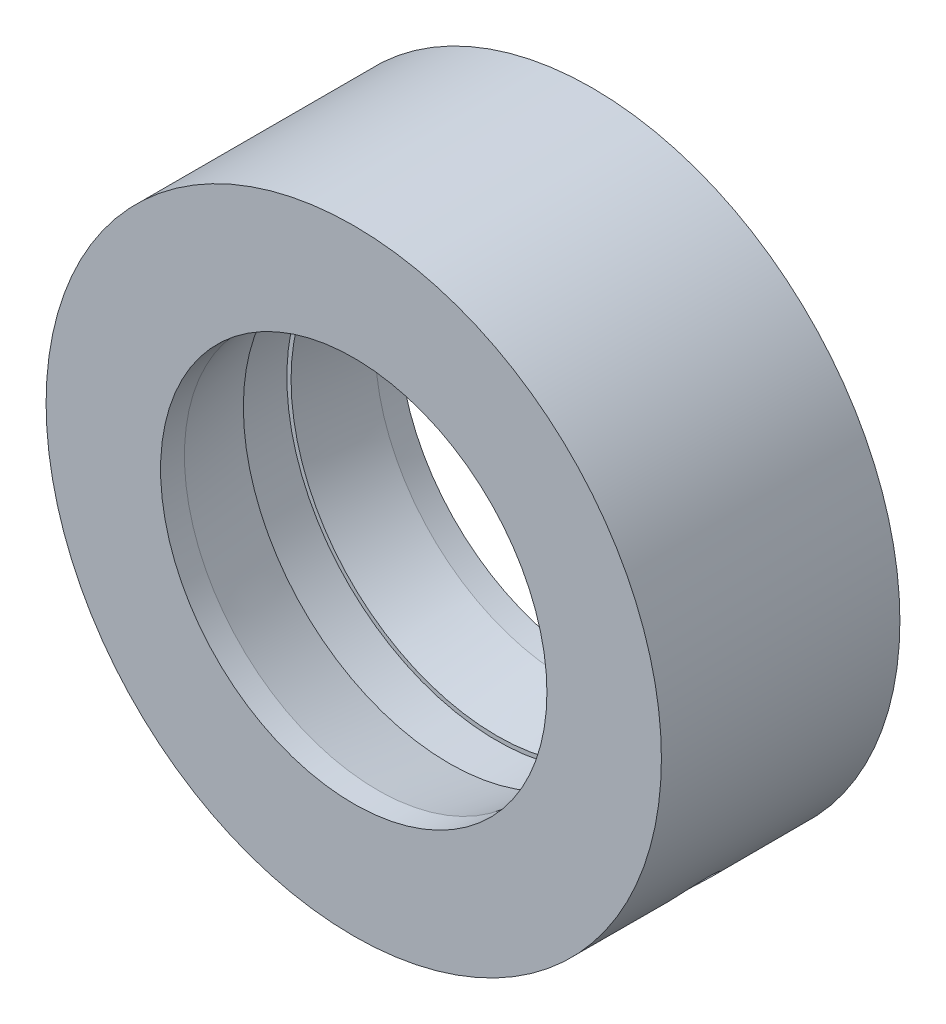
ISO-10303-21;
HEADER;
FILE_DESCRIPTION(('STEP AP214'),'2;1');
FILE_NAME('part.step','',(''),(''),'','','');
FILE_SCHEMA(('AUTOMOTIVE_DESIGN { 1 0 10303 214 1 1 1 1 }'));
ENDSEC;
DATA;
#1=APPLICATION_CONTEXT('core data for automotive mechanical design processes');
#2=APPLICATION_PROTOCOL_DEFINITION('international standard','automotive_design',2000,#1);
#3=PRODUCT_CONTEXT('',#1,'mechanical');
#4=PRODUCT('Part','Part','',(#3));
#5=PRODUCT_RELATED_PRODUCT_CATEGORY('part','',(#4));
#6=PRODUCT_DEFINITION_FORMATION('','',#4);
#7=PRODUCT_DEFINITION_CONTEXT('part definition',#1,'design');
#8=PRODUCT_DEFINITION('design','',#6,#7);
#9=PRODUCT_DEFINITION_SHAPE('','',#8);
#10=(LENGTH_UNIT() NAMED_UNIT(*) SI_UNIT(.MILLI.,.METRE.));
#11=(NAMED_UNIT(*) PLANE_ANGLE_UNIT() SI_UNIT($,.RADIAN.));
#12=(NAMED_UNIT(*) SI_UNIT($,.STERADIAN.) SOLID_ANGLE_UNIT());
#13=UNCERTAINTY_MEASURE_WITH_UNIT(LENGTH_MEASURE(1.E-05),#10,'distance_accuracy_value','');
#14=(GEOMETRIC_REPRESENTATION_CONTEXT(3) GLOBAL_UNCERTAINTY_ASSIGNED_CONTEXT((#13)) GLOBAL_UNIT_ASSIGNED_CONTEXT((#10,
#11,#12)) REPRESENTATION_CONTEXT('',''));
#15=CARTESIAN_POINT('',(0.,0.,0.));
#16=DIRECTION('',(0.,0.,1.));
#17=DIRECTION('',(1.,0.,0.));
#18=AXIS2_PLACEMENT_3D('',#15,#16,#17);
#19=CARTESIAN_POINT('',(70.0352073297109,17.5689247360191,9.));
#20=DIRECTION('',(0.,0.,1.));
#21=DIRECTION('',(1.,0.,0.));
#22=AXIS2_PLACEMENT_3D('',#19,#20,#21);
#23=PLANE('',#22);
#24=CARTESIAN_POINT('',(73.461996441999,0.,9.));
#25=DIRECTION('',(0.,0.,1.));
#26=DIRECTION('',(1.,0.,0.));
#27=AXIS2_PLACEMENT_3D('',#24,#25,#26);
#28=CIRCLE('',#27,8.09999999999999);
#29=CARTESIAN_POINT('',(81.561996441999,0.,9.));
#30=VERTEX_POINT('',#29);
#31=EDGE_CURVE('E101',#30,#30,#28,.T.);
#32=ORIENTED_EDGE('',*,*,#31,.F.);
#33=EDGE_LOOP('',(#32));
#34=FACE_BOUND('',#33,.T.);
#35=CARTESIAN_POINT('',(73.461996441999,0.,9.));
#36=DIRECTION('',(0.,0.,1.));
#37=DIRECTION('',(1.,0.,0.));
#38=AXIS2_PLACEMENT_3D('',#35,#36,#37);
#39=CIRCLE('',#38,12.9);
#40=CARTESIAN_POINT('',(86.361996441999,0.,9.));
#41=VERTEX_POINT('',#40);
#42=EDGE_CURVE('E68',#41,#41,#39,.T.);
#43=ORIENTED_EDGE('',*,*,#42,.T.);
#44=EDGE_LOOP('',(#43));
#45=FACE_BOUND('',#44,.T.);
#46=ADVANCED_FACE('F42',(#34,#45),#23,.T.);
#47=CARTESIAN_POINT('',(5.89307170597994,46.573210887712,-1.));
#48=DIRECTION('',(0.,0.,-1.));
#49=DIRECTION('',(-1.,0.,0.));
#50=AXIS2_PLACEMENT_3D('',#47,#48,#49);
#51=PLANE('',#50);
#52=CARTESIAN_POINT('',(73.461996441999,0.,-1.));
#53=DIRECTION('',(0.,0.,-1.));
#54=DIRECTION('',(-1.,0.,0.));
#55=AXIS2_PLACEMENT_3D('',#52,#53,#54);
#56=CIRCLE('',#55,8.09999999999999);
#57=CARTESIAN_POINT('',(65.361996441999,0.,-1.));
#58=VERTEX_POINT('',#57);
#59=EDGE_CURVE('E109',#58,#58,#56,.T.);
#60=ORIENTED_EDGE('',*,*,#59,.F.);
#61=EDGE_LOOP('',(#60));
#62=FACE_BOUND('',#61,.T.);
#63=CARTESIAN_POINT('',(73.461996441999,0.,-1.));
#64=DIRECTION('',(0.,0.,-1.));
#65=DIRECTION('',(-1.,0.,0.));
#66=AXIS2_PLACEMENT_3D('',#63,#64,#65);
#67=CIRCLE('',#66,12.9);
#68=CARTESIAN_POINT('',(60.561996441999,0.,-1.));
#69=VERTEX_POINT('',#68);
#70=EDGE_CURVE('E102',#69,#69,#67,.T.);
#71=ORIENTED_EDGE('',*,*,#70,.T.);
#72=EDGE_LOOP('',(#71));
#73=FACE_BOUND('',#72,.T.);
#74=ADVANCED_FACE('F132',(#62,#73),#51,.T.);
#75=CARTESIAN_POINT('',(73.461996441999,0.,8.));
#76=DIRECTION('',(0.,0.,-1.));
#77=DIRECTION('',(-1.,0.,0.));
#78=AXIS2_PLACEMENT_3D('',#75,#76,#77);
#79=CYLINDRICAL_SURFACE('',#78,12.9);
#80=ORIENTED_EDGE('',*,*,#42,.F.);
#81=EDGE_LOOP('',(#80));
#82=FACE_BOUND('',#81,.T.);
#83=ORIENTED_EDGE('',*,*,#70,.F.);
#84=EDGE_LOOP('',(#83));
#85=FACE_BOUND('',#84,.T.);
#86=CARTESIAN_POINT('',(83.2958693438563,-8.3489486613655,4.));
#87=CARTESIAN_POINT('',(83.2958679778543,-8.34895077080571,4.0560686927923));
#88=CARTESIAN_POINT('',(83.2927988602991,-8.35256943382663,4.11217590008152));
#89=CARTESIAN_POINT('',(83.2805789666321,-8.36693030112704,4.22283855553347));
#90=CARTESIAN_POINT('',(83.2714212406867,-8.37768064582371,4.2773921560408));
#91=CARTESIAN_POINT('',(83.2472262282993,-8.40592777719485,4.3833284360185));
#92=CARTESIAN_POINT('',(83.2321922568248,-8.42342076006646,4.43471288441408));
#93=CARTESIAN_POINT('',(83.1965793612389,-8.46455148461395,4.53287908598774));
#94=CARTESIAN_POINT('',(83.1760016422507,-8.48818789076727,4.57966183648857));
#95=CARTESIAN_POINT('',(83.1297098559688,-8.54087501795303,4.6674233010226));
#96=CARTESIAN_POINT('',(83.1039847847291,-8.56993732935419,4.70838925359269));
#97=CARTESIAN_POINT('',(83.0480185288929,-8.63249316522333,4.78324516038533));
#98=CARTESIAN_POINT('',(83.0177771428087,-8.66598688738366,4.81713479874815));
#99=CARTESIAN_POINT('',(82.9534542433199,-8.73638954336931,4.87692335105775));
#100=CARTESIAN_POINT('',(82.9193669870815,-8.77330356945993,4.90281009325174));
#101=CARTESIAN_POINT('',(82.8482469483251,-8.84935076158856,4.94578150669782));
#102=CARTESIAN_POINT('',(82.8112142095202,-8.88848389469104,4.96286630854853));
#103=CARTESIAN_POINT('',(82.7352560066971,-8.96770097299869,4.9877151589862));
#104=CARTESIAN_POINT('',(82.6963344360287,-9.00778288186895,4.99549759827438));
#105=CARTESIAN_POINT('',(82.6176041838779,-9.08779381052677,5.00157613658924));
#106=CARTESIAN_POINT('',(82.577795517957,-9.12772283298191,4.99987240189449));
#107=CARTESIAN_POINT('',(82.4985288780831,-9.20620366107032,4.98704235213372));
#108=CARTESIAN_POINT('',(82.4590702981902,-9.24475849473057,4.97593828530593));
#109=CARTESIAN_POINT('',(82.3815774486548,-9.31954807799195,4.9446558540604));
#110=CARTESIAN_POINT('',(82.3435431885977,-9.35578281198032,4.92447742858545));
#111=CARTESIAN_POINT('',(82.2700302184035,-9.42502496954491,4.87560276361835));
#112=CARTESIAN_POINT('',(82.2345535807071,-9.45802978348813,4.84689971092252));
#113=CARTESIAN_POINT('',(82.1673012837466,-9.51996643828745,4.78179535263843));
#114=CARTESIAN_POINT('',(82.1355256866247,-9.54889821075697,4.74539391781963));
#115=CARTESIAN_POINT('',(82.0766213139136,-9.60207375601394,4.66581571288913));
#116=CARTESIAN_POINT('',(82.0495046093816,-9.62630537114839,4.62262188176185));
#117=CARTESIAN_POINT('',(82.0009144246372,-9.66943320841673,4.53074479264113));
#118=CARTESIAN_POINT('',(81.9794409537337,-9.68832942174951,4.48206152559269));
#119=CARTESIAN_POINT('',(81.9428588374096,-9.72036868740443,4.38056604990191));
#120=CARTESIAN_POINT('',(81.9277520136537,-9.73351009316717,4.32775266464207));
#121=CARTESIAN_POINT('',(81.9044346173722,-9.75374174534923,4.21950941814303));
#122=CARTESIAN_POINT('',(81.896223931791,-9.76083209096995,4.1640795998135));
#123=CARTESIAN_POINT('',(81.8869970931782,-9.76879735987429,4.05231509557836));
#124=CARTESIAN_POINT('',(81.8859642316165,-9.76968671782549,3.99598281728655));
#125=CARTESIAN_POINT('',(81.891084998113,-9.76526892105391,3.88389118478705));
#126=CARTESIAN_POINT('',(81.897238574021,-9.75996181129737,3.82813182642478));
#127=CARTESIAN_POINT('',(81.9165056326831,-9.74327638807498,3.71883360750543));
#128=CARTESIAN_POINT('',(81.9296111560678,-9.73190501757582,3.66529228291963));
#129=CARTESIAN_POINT('',(81.9623251624343,-9.70334377443696,3.56187366859624));
#130=CARTESIAN_POINT('',(81.9819337304674,-9.68615382569778,3.51199642679049));
#131=CARTESIAN_POINT('',(82.0270328401724,-9.64629749629005,3.41721843359261));
#132=CARTESIAN_POINT('',(82.0525344229827,-9.6236208319251,3.37232726082206));
#133=CARTESIAN_POINT('',(82.1085521513051,-9.57332166198447,3.28889275066278));
#134=CARTESIAN_POINT('',(82.1390683630245,-9.54569909110832,3.25034949709808));
#135=CARTESIAN_POINT('',(82.2041867147842,-9.48609810768829,3.18063216260694));
#136=CARTESIAN_POINT('',(82.2387963929892,-9.45411164182664,3.1494720047433));
#137=CARTESIAN_POINT('',(82.3109556215722,-9.38660530505478,3.09550156521914));
#138=CARTESIAN_POINT('',(82.3485051431201,-9.35108546879417,3.07269120168756));
#139=CARTESIAN_POINT('',(82.4253334912171,-9.27746806332628,3.03609723174515));
#140=CARTESIAN_POINT('',(82.4646101447523,-9.23937370260897,3.0223026103203));
#141=CARTESIAN_POINT('',(82.5437545654349,-9.16159082788018,3.0040936908135));
#142=CARTESIAN_POINT('',(82.5836223234886,-9.12190233837701,2.99967924857595));
#143=CARTESIAN_POINT('',(82.6626921151934,-9.04214271951068,3.00035625897872));
#144=CARTESIAN_POINT('',(82.7018955505992,-9.00207277819965,3.00542424594407));
#145=CARTESIAN_POINT('',(82.7786482870931,-8.92261457480847,3.02487191783324));
#146=CARTESIAN_POINT('',(82.8161975828981,-8.88322631490578,3.03925163249541));
#147=CARTESIAN_POINT('',(82.8886536037679,-8.80630057013115,3.07691306741759));
#148=CARTESIAN_POINT('',(82.9235596918581,-8.76876353213194,3.1001969253191));
#149=CARTESIAN_POINT('',(82.9898356039768,-8.69670514302144,3.15500229552127));
#150=CARTESIAN_POINT('',(83.0212054907647,-8.66218373839202,3.18652366159208));
#151=CARTESIAN_POINT('',(83.0797301352514,-8.59715770621714,3.25700840398523));
#152=CARTESIAN_POINT('',(83.1068735296014,-8.5666639396404,3.2959912353779));
#153=CARTESIAN_POINT('',(83.1562181888337,-8.51078482398161,3.38025837316047));
#154=CARTESIAN_POINT('',(83.1784182536765,-8.48540071546014,3.42554420533634));
#155=CARTESIAN_POINT('',(83.2173952603791,-8.44056163124663,3.52120295541299));
#156=CARTESIAN_POINT('',(83.2341637242443,-8.42111592728178,3.57158366644666));
#157=CARTESIAN_POINT('',(83.2618422980066,-8.38889007308266,3.67591045802161));
#158=CARTESIAN_POINT('',(83.2727591972574,-8.37610219851214,3.72985232467412));
#159=CARTESIAN_POINT('',(83.2857018974885,-8.36091310966384,3.82009736660198));
#160=CARTESIAN_POINT('',(83.2895106949207,-8.35643340486692,3.85581847512212));
#161=CARTESIAN_POINT('',(83.2945948554633,-8.35045050415653,3.92768771552262));
#162=CARTESIAN_POINT('',(83.2958702249239,-8.34894730078232,3.96383584633239));
#163=CARTESIAN_POINT('',(83.2958693438563,-8.3489486613655,4.));
#164=B_SPLINE_CURVE_WITH_KNOTS('',3,(#86,#87,#88,#89,#90,#91,#92,#93,#94,#95,#96,#97,#98,#99,
#100,#101,#102,#103,#104,#105,#106,#107,#108,#109,#110,#111,#112,#113,#114,#115,#116,#117,#118,
#119,#120,#121,#122,#123,#124,#125,#126,#127,#128,#129,#130,#131,#132,#133,#134,#135,#136,#137,
#138,#139,#140,#141,#142,#143,#144,#145,#146,#147,#148,#149,#150,#151,#152,#153,#154,#155,#156,
#157,#158,#159,#160,#161,#162,#163),.UNSPECIFIED.,.T.,.F.,(4,2,2,2,2,2,2,2,2,2,2,2,2,2,2,2,2,2,
2,2,2,2,2,2,2,2,2,2,2,2,2,2,2,2,2,2,2,2,4),(0.,0.16807401486883,0.336340207716254,
0.504511613206887,0.672646490346384,0.841144720072073,1.00965046931039,1.17841125535225,
1.34716953733716,1.51559363070521,1.68401477185774,1.85203841305346,2.02006318482033,
2.18822261138097,2.35638486100994,2.52497645035437,2.69356831780016,2.8622083911048,
3.03084569966207,3.19909032261037,3.36733372465584,3.53538491721392,3.70343830774936,
3.87180915287032,4.04018222114365,4.20887032472105,4.37755677424071,4.5460367433246,
4.71451412317141,4.88257513212563,5.05063667780991,5.21873859583408,5.38683752996466,
5.5553808888592,5.7239651187327,5.89281123181304,6.06146101259752,6.1698685647274,
6.27827584512834),.UNSPECIFIED.);
#165=CARTESIAN_POINT('',(83.2958693438563,-8.3489486613655,4.));
#166=VERTEX_POINT('',#165);
#167=EDGE_CURVE('E76',#166,#166,#164,.T.);
#168=ORIENTED_EDGE('',*,*,#167,.F.);
#169=EDGE_LOOP('',(#168));
#170=FACE_BOUND('',#169,.T.);
#171=ADVANCED_FACE('F140',(#82,#85,#170),#79,.T.);
#172=CARTESIAN_POINT('',(73.461996441999,0.,5.));
#173=DIRECTION('',(0.,0.,-1.));
#174=DIRECTION('',(-1.,0.,0.));
#175=AXIS2_PLACEMENT_3D('',#172,#173,#174);
#176=CYLINDRICAL_SURFACE('',#175,8.80530792283387);
#177=CARTESIAN_POINT('',(73.461996441999,0.,5.));
#178=DIRECTION('',(0.,0.,1.));
#179=DIRECTION('',(1.,0.,0.));
#180=AXIS2_PLACEMENT_3D('',#177,#178,#179);
#181=CIRCLE('',#180,8.80530792283387);
#182=CARTESIAN_POINT('',(79.7235443421635,-6.19083722204575,5.));
#183=VERTEX_POINT('',#182);
#184=EDGE_CURVE('E74',#183,#183,#181,.T.);
#185=ORIENTED_EDGE('',*,*,#184,.T.);
#186=CARTESIAN_POINT('',(79.7235443421635,-6.19083722204575,5.));
#187=CARTESIAN_POINT('',(79.6842021134261,-6.2306277895326,4.99999760429375));
#188=CARTESIAN_POINT('',(79.6444524104711,-6.27006585448339,4.99528769653179));
#189=CARTESIAN_POINT('',(79.565321550183,-6.3471197991519,4.97656874569593));
#190=CARTESIAN_POINT('',(79.5259408304978,-6.38473369325154,4.96254980312205));
#191=CARTESIAN_POINT('',(79.4488078984907,-6.45711485080329,4.92562624030404));
#192=CARTESIAN_POINT('',(79.411054690417,-6.49188386686183,4.9027271414187));
#193=CARTESIAN_POINT('',(79.3383610497241,-6.55775845528242,4.84870443651559));
#194=CARTESIAN_POINT('',(79.3034201005754,-6.58886470087618,4.81758234533838));
#195=CARTESIAN_POINT('',(79.2373592399061,-6.64684695139088,4.74785371313924));
#196=CARTESIAN_POINT('',(79.2062545302971,-6.67370623831458,4.70921886611398));
#197=CARTESIAN_POINT('',(79.1490828774532,-6.72249295572893,4.62562219185992));
#198=CARTESIAN_POINT('',(79.123016182069,-6.7444201435882,4.580660053541));
#199=CARTESIAN_POINT('',(79.0767726718288,-6.78296747329506,4.48552211194951));
#200=CARTESIAN_POINT('',(79.0566136399394,-6.79957160574731,4.43533117153182));
#201=CARTESIAN_POINT('',(79.0230317026216,-6.82706439479545,4.33126541331415));
#202=CARTESIAN_POINT('',(79.0096086105563,-6.83795320974974,4.27739069762993));
#203=CARTESIAN_POINT('',(78.9900427520621,-6.85378078264055,4.16769979930971));
#204=CARTESIAN_POINT('',(78.9838729655688,-6.85874162464708,4.11189162461321));
#205=CARTESIAN_POINT('',(78.9789595895297,-6.86269449500951,3.99974044566775));
#206=CARTESIAN_POINT('',(78.9802157721082,-6.86168670652066,3.94339745788319));
#207=CARTESIAN_POINT('',(78.990083845665,-6.85373884346947,3.83203178182306));
#208=CARTESIAN_POINT('',(78.9986640438641,-6.84682432863553,3.7770044535043));
#209=CARTESIAN_POINT('',(79.0228133742763,-6.82722508925317,3.66957400767169));
#210=CARTESIAN_POINT('',(79.0383826206618,-6.81454027044155,3.61717093304296));
#211=CARTESIAN_POINT('',(79.0759748760277,-6.78360409887392,3.51634948997096));
#212=CARTESIAN_POINT('',(79.0980114192043,-6.76534106922464,3.46793975339231));
#213=CARTESIAN_POINT('',(79.1477348124668,-6.72360594677793,3.37657405708082));
#214=CARTESIAN_POINT('',(79.1754218574108,-6.70013367433701,3.33361828551119));
#215=CARTESIAN_POINT('',(79.2356403817828,-6.64831298043783,3.25414984515278));
#216=CARTESIAN_POINT('',(79.2681959368809,-6.61994021047688,3.21767128803848));
#217=CARTESIAN_POINT('',(79.3369425387238,-6.55900618643886,3.15245897712139));
#218=CARTESIAN_POINT('',(79.3731335803549,-6.52644493825345,3.12372521242464));
#219=CARTESIAN_POINT('',(79.4479569444728,-6.45788631866433,3.07482995643706));
#220=CARTESIAN_POINT('',(79.4865888452605,-6.42188954026029,3.05466698902389));
#221=CARTESIAN_POINT('',(79.5650706401885,-6.34735058076237,3.02349547563421));
#222=CARTESIAN_POINT('',(79.6049204877382,-6.30880849696996,3.01248657993596));
#223=CARTESIAN_POINT('',(79.6844042724558,-6.23042426075212,2.99998077014418));
#224=CARTESIAN_POINT('',(79.7240382143996,-6.19059024552632,2.99843285100094));
#225=CARTESIAN_POINT('',(79.80216382876,-6.11055257831071,3.00475550532107));
#226=CARTESIAN_POINT('',(79.840655517421,-6.07034893158819,3.01262594477758));
#227=CARTESIAN_POINT('',(79.9153755197575,-5.99085280391375,3.03752320102198));
#228=CARTESIAN_POINT('',(79.95160848216,-5.95155856374308,3.05453046863985));
#229=CARTESIAN_POINT('',(80.0209963823624,-5.8750012000345,3.09719507347417));
#230=CARTESIAN_POINT('',(80.0541512228685,-5.83773814071391,3.1228526839937));
#231=CARTESIAN_POINT('',(80.116767601576,-5.76625874282788,3.18223216087126));
#232=CARTESIAN_POINT('',(80.1462107893993,-5.73205776710825,3.21599186890473));
#233=CARTESIAN_POINT('',(80.2005854153733,-5.66803615695006,3.29056323609974));
#234=CARTESIAN_POINT('',(80.2255167047604,-5.63821566694834,3.33137512769495));
#235=CARTESIAN_POINT('',(80.2704680741705,-5.5838530606726,3.41912099449909));
#236=CARTESIAN_POINT('',(80.2904649022843,-5.55933599936861,3.46608241612353));
#237=CARTESIAN_POINT('',(80.3250062608926,-5.51663858519481,3.56466101749643));
#238=CARTESIAN_POINT('',(80.3395509020399,-5.49845810372392,3.6162781027313));
#239=CARTESIAN_POINT('',(80.3628787616574,-5.46915195318891,3.72255813588419));
#240=CARTESIAN_POINT('',(80.3716778031772,-5.45800691177218,3.777212265073));
#241=CARTESIAN_POINT('',(80.3834123849399,-5.44311861882955,3.88813375666271));
#242=CARTESIAN_POINT('',(80.3863481685998,-5.43937506002614,3.94440105199354));
#243=CARTESIAN_POINT('',(80.3863018884642,-5.43943392670686,4.05657609344591));
#244=CARTESIAN_POINT('',(80.3833566956986,-5.44318933708982,4.11248388885774));
#245=CARTESIAN_POINT('',(80.3716771012139,-5.45800774094245,4.22270268649157));
#246=CARTESIAN_POINT('',(80.3629426990457,-5.46907073497896,4.27701368858972));
#247=CARTESIAN_POINT('',(80.3398502901272,-5.49808286687488,4.38249281786481));
#248=CARTESIAN_POINT('',(80.3254937601361,-5.51603019640678,4.43366176628257));
#249=CARTESIAN_POINT('',(80.2914258821887,-5.55815362270335,4.53144904976686));
#250=CARTESIAN_POINT('',(80.2717144993435,-5.58232976005092,4.5780673551816));
#251=CARTESIAN_POINT('',(80.2271798111812,-5.63621924267736,4.66573339109537));
#252=CARTESIAN_POINT('',(80.2023264822901,-5.66596500721151,4.70674594236119));
#253=CARTESIAN_POINT('',(80.1480759115914,-5.72988152276768,4.78173380653001));
#254=CARTESIAN_POINT('',(80.1186775760982,-5.76405333852859,4.81570742100486));
#255=CARTESIAN_POINT('',(80.0558606985675,-5.83581033878949,4.87576136074637));
#256=CARTESIAN_POINT('',(80.0224275175374,-5.87340782346493,4.90181165853103));
#257=CARTESIAN_POINT('',(79.9524349664694,-5.95066056151288,4.94507092907295));
#258=CARTESIAN_POINT('',(79.915879100904,-5.99031348898122,4.9622896649682));
#259=CARTESIAN_POINT('',(79.8532217621989,-6.05698179350738,4.98319967519416));
#260=CARTESIAN_POINT('',(79.827723663484,-6.08377761011152,4.98949071702932));
#261=CARTESIAN_POINT('',(79.7760594117537,-6.13738072982828,4.99789166965709));
#262=CARTESIAN_POINT('',(79.7498932625806,-6.16418803287395,5.00000160449154));
#263=CARTESIAN_POINT('',(79.7235443421635,-6.19083722204575,5.));
#264=B_SPLINE_CURVE_WITH_KNOTS('',3,(#186,#187,#188,#189,#190,#191,#192,#193,#194,#195,#196,
#197,#198,#199,#200,#201,#202,#203,#204,#205,#206,#207,#208,#209,#210,#211,#212,#213,#214,#215,
#216,#217,#218,#219,#220,#221,#222,#223,#224,#225,#226,#227,#228,#229,#230,#231,#232,#233,#234,
#235,#236,#237,#238,#239,#240,#241,#242,#243,#244,#245,#246,#247,#248,#249,#250,#251,#252,#253,
#254,#255,#256,#257,#258,#259,#260,#261,#262,#263),.UNSPECIFIED.,.T.,.F.,(4,2,2,2,2,2,2,2,2,2,2,
2,2,2,2,2,2,2,2,2,2,2,2,2,2,2,2,2,2,2,2,2,2,2,2,2,2,2,4),(0.,0.167731929129619,
0.335642515568942,0.503448868259548,0.671224329173075,0.839644618194341,1.00807319072993,
1.17700367037689,1.34592946909898,1.51422396991649,1.68251330642329,1.8500780848344,
2.01764560066763,2.18556631863584,2.35349282833909,2.52227904683391,2.69106502790988,
2.85982192770046,3.02857238001389,3.19641227391259,3.36424977976981,3.53172960218722,
3.69921471653848,3.8674978558697,4.03578654272112,4.20485370450786,4.37391743487168,
4.54251358756825,4.71110274073585,4.87863823570292,5.04617374366584,5.21366527471419,
5.38115789705745,5.54965759317438,5.71819789942912,5.88736919537135,6.05635307010922,
6.16868988495286,6.28102605384526),.UNSPECIFIED.);
#265=CARTESIAN_POINT('',(79.7235443421635,-6.19083722204575,3.));
#266=VERTEX_POINT('',#265);
#267=EDGE_CURVE('E59',#183,#266,#264,.T.);
#268=ORIENTED_EDGE('',*,*,#267,.T.);
#269=CARTESIAN_POINT('',(73.461996441999,0.,3.));
#270=DIRECTION('',(0.,0.,1.));
#271=DIRECTION('',(1.,0.,0.));
#272=AXIS2_PLACEMENT_3D('',#269,#270,#271);
#273=CIRCLE('',#272,8.80530792283387);
#274=EDGE_CURVE('E72',#266,#266,#273,.T.);
#275=ORIENTED_EDGE('',*,*,#274,.F.);
#276=EDGE_CURVE('E61',#266,#183,#264,.T.);
#277=ORIENTED_EDGE('',*,*,#276,.T.);
#278=EDGE_LOOP('',(#185,#268,#275,#277));
#279=FACE_BOUND('',#278,.T.);
#280=ADVANCED_FACE('F71',(#279),#176,.F.);
#281=CARTESIAN_POINT('',(73.461996441999,0.,0.));
#282=DIRECTION('',(0.,0.,1.));
#283=DIRECTION('',(1.,0.,0.));
#284=AXIS2_PLACEMENT_3D('',#281,#282,#283);
#285=CONICAL_SURFACE('',#284,8.09999999999999,0.174532925199433);
#286=CARTESIAN_POINT('',(73.461996441999,0.,0.));
#287=DIRECTION('',(0.,0.,1.));
#288=DIRECTION('',(1.,0.,0.));
#289=AXIS2_PLACEMENT_3D('',#286,#287,#288);
#290=CIRCLE('',#289,8.09999999999999);
#291=CARTESIAN_POINT('',(81.561996441999,0.,0.));
#292=VERTEX_POINT('',#291);
#293=EDGE_CURVE('E12',#292,#292,#290,.T.);
#294=ORIENTED_EDGE('',*,*,#293,.F.);
#295=EDGE_LOOP('',(#294));
#296=FACE_BOUND('',#295,.T.);
#297=CARTESIAN_POINT('',(73.461996441999,0.,3.));
#298=DIRECTION('',(0.,0.,1.));
#299=DIRECTION('',(1.,0.,0.));
#300=AXIS2_PLACEMENT_3D('',#297,#298,#299);
#301=CIRCLE('',#300,8.62898094212539);
#302=CARTESIAN_POINT('',(82.0909773841244,0.,3.));
#303=VERTEX_POINT('',#302);
#304=EDGE_CURVE('E46',#303,#303,#301,.T.);
#305=ORIENTED_EDGE('',*,*,#304,.T.);
#306=EDGE_LOOP('',(#305));
#307=FACE_BOUND('',#306,.T.);
#308=ADVANCED_FACE('F44',(#296,#307),#285,.F.);
#309=CARTESIAN_POINT('',(73.461996441999,0.,8.));
#310=DIRECTION('',(0.,0.,-1.));
#311=DIRECTION('',(1.,0.,0.));
#312=AXIS2_PLACEMENT_3D('',#309,#310,#311);
#313=CONICAL_SURFACE('',#312,8.09999999999999,0.174532925199433);
#314=CARTESIAN_POINT('',(73.461996441999,0.,5.));
#315=DIRECTION('',(0.,0.,1.));
#316=DIRECTION('',(1.,0.,0.));
#317=AXIS2_PLACEMENT_3D('',#314,#315,#316);
#318=CIRCLE('',#317,8.62898094212539);
#319=CARTESIAN_POINT('',(82.0909773841244,0.,5.));
#320=VERTEX_POINT('',#319);
#321=EDGE_CURVE('E52',#320,#320,#318,.T.);
#322=ORIENTED_EDGE('',*,*,#321,.F.);
#323=EDGE_LOOP('',(#322));
#324=FACE_BOUND('',#323,.T.);
#325=CARTESIAN_POINT('',(73.461996441999,0.,8.));
#326=DIRECTION('',(0.,0.,1.));
#327=DIRECTION('',(1.,0.,0.));
#328=AXIS2_PLACEMENT_3D('',#325,#326,#327);
#329=CIRCLE('',#328,8.09999999999999);
#330=CARTESIAN_POINT('',(81.561996441999,0.,8.));
#331=VERTEX_POINT('',#330);
#332=EDGE_CURVE('E98',#331,#331,#329,.T.);
#333=ORIENTED_EDGE('',*,*,#332,.T.);
#334=EDGE_LOOP('',(#333));
#335=FACE_BOUND('',#334,.T.);
#336=ADVANCED_FACE('F93',(#324,#335),#313,.F.);
#337=CARTESIAN_POINT('',(73.461996441999,0.,5.));
#338=DIRECTION('',(0.,0.,1.));
#339=DIRECTION('',(1.,0.,0.));
#340=AXIS2_PLACEMENT_3D('',#337,#338,#339);
#341=PLANE('',#340);
#342=ORIENTED_EDGE('',*,*,#321,.T.);
#343=EDGE_LOOP('',(#342));
#344=FACE_BOUND('',#343,.T.);
#345=ORIENTED_EDGE('',*,*,#184,.F.);
#346=EDGE_LOOP('',(#345));
#347=FACE_BOUND('',#346,.T.);
#348=ADVANCED_FACE('F90',(#344,#347),#341,.F.);
#349=CARTESIAN_POINT('',(73.461996441999,0.,3.));
#350=DIRECTION('',(0.,0.,1.));
#351=DIRECTION('',(1.,0.,0.));
#352=AXIS2_PLACEMENT_3D('',#349,#350,#351);
#353=PLANE('',#352);
#354=ORIENTED_EDGE('',*,*,#304,.F.);
#355=EDGE_LOOP('',(#354));
#356=FACE_BOUND('',#355,.T.);
#357=ORIENTED_EDGE('',*,*,#274,.T.);
#358=EDGE_LOOP('',(#357));
#359=FACE_BOUND('',#358,.T.);
#360=ADVANCED_FACE('F78',(#356,#359),#353,.T.);
#361=CARTESIAN_POINT('',(75.6893828027367,-2.15667568261899,4.));
#362=DIRECTION('',(0.707106781186549,-0.707106781186546,0.));
#363=DIRECTION('',(0.707106781186546,0.707106781186549,0.));
#364=AXIS2_PLACEMENT_3D('',#361,#362,#363);
#365=CYLINDRICAL_SURFACE('',#364,0.999999999999998);
#366=ORIENTED_EDGE('',*,*,#276,.F.);
#367=ORIENTED_EDGE('',*,*,#267,.F.);
#368=EDGE_LOOP('',(#366,#367));
#369=FACE_BOUND('',#368,.T.);
#370=ORIENTED_EDGE('',*,*,#167,.T.);
#371=EDGE_LOOP('',(#370));
#372=FACE_BOUND('',#371,.T.);
#373=ADVANCED_FACE('F62',(#369,#372),#365,.F.);
#374=CARTESIAN_POINT('',(73.461996441999,0.,9.));
#375=DIRECTION('',(0.,0.,-1.));
#376=DIRECTION('',(-1.,0.,0.));
#377=AXIS2_PLACEMENT_3D('',#374,#375,#376);
#378=CYLINDRICAL_SURFACE('',#377,8.09999999999999);
#379=ORIENTED_EDGE('',*,*,#31,.T.);
#380=EDGE_LOOP('',(#379));
#381=FACE_BOUND('',#380,.T.);
#382=ORIENTED_EDGE('',*,*,#332,.F.);
#383=EDGE_LOOP('',(#382));
#384=FACE_BOUND('',#383,.T.);
#385=ADVANCED_FACE('F128',(#381,#384),#378,.F.);
#386=CARTESIAN_POINT('',(73.461996441999,0.,-1.));
#387=DIRECTION('',(0.,0.,1.));
#388=DIRECTION('',(1.,0.,0.));
#389=AXIS2_PLACEMENT_3D('',#386,#387,#388);
#390=CYLINDRICAL_SURFACE('',#389,8.09999999999999);
#391=ORIENTED_EDGE('',*,*,#59,.T.);
#392=EDGE_LOOP('',(#391));
#393=FACE_BOUND('',#392,.T.);
#394=ORIENTED_EDGE('',*,*,#293,.T.);
#395=EDGE_LOOP('',(#394));
#396=FACE_BOUND('',#395,.T.);
#397=ADVANCED_FACE('F136',(#393,#396),#390,.F.);
#398=CLOSED_SHELL('',(#46,#74,#171,#280,#308,#336,#348,#360,#373,#385,#397));
#399=MANIFOLD_SOLID_BREP('B2',#398);
#400=ADVANCED_BREP_SHAPE_REPRESENTATION('',(#18,#399),#14);
#401=SHAPE_DEFINITION_REPRESENTATION(#9,#400);
ENDSEC;
END-ISO-10303-21;
